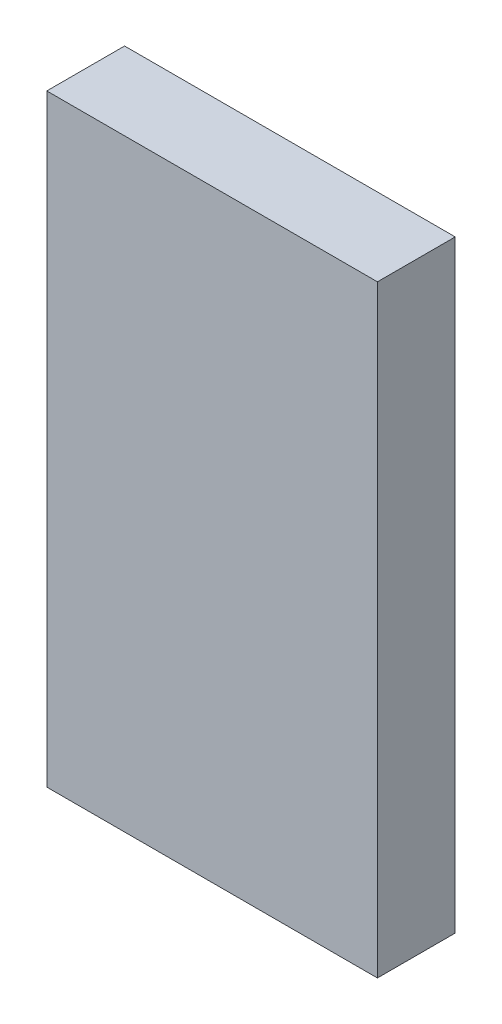
ISO-10303-21;
HEADER;
FILE_DESCRIPTION(('STEP AP214'),'2;1');
FILE_NAME('part.step','',(''),(''),'','','');
FILE_SCHEMA(('AUTOMOTIVE_DESIGN { 1 0 10303 214 1 1 1 1 }'));
ENDSEC;
DATA;
#1=APPLICATION_CONTEXT('core data for automotive mechanical design processes');
#2=APPLICATION_PROTOCOL_DEFINITION('international standard','automotive_design',2000,#1);
#3=PRODUCT_CONTEXT('',#1,'mechanical');
#4=PRODUCT('Part','Part','',(#3));
#5=PRODUCT_RELATED_PRODUCT_CATEGORY('part','',(#4));
#6=PRODUCT_DEFINITION_FORMATION('','',#4);
#7=PRODUCT_DEFINITION_CONTEXT('part definition',#1,'design');
#8=PRODUCT_DEFINITION('design','',#6,#7);
#9=PRODUCT_DEFINITION_SHAPE('','',#8);
#10=(LENGTH_UNIT() NAMED_UNIT(*) SI_UNIT(.MILLI.,.METRE.));
#11=(NAMED_UNIT(*) PLANE_ANGLE_UNIT() SI_UNIT($,.RADIAN.));
#12=(NAMED_UNIT(*) SI_UNIT($,.STERADIAN.) SOLID_ANGLE_UNIT());
#13=UNCERTAINTY_MEASURE_WITH_UNIT(LENGTH_MEASURE(1.E-05),#10,'distance_accuracy_value','');
#14=(GEOMETRIC_REPRESENTATION_CONTEXT(3) GLOBAL_UNCERTAINTY_ASSIGNED_CONTEXT((#13)) GLOBAL_UNIT_ASSIGNED_CONTEXT((#10,
#11,#12)) REPRESENTATION_CONTEXT('',''));
#15=CARTESIAN_POINT('',(0.,0.,0.));
#16=DIRECTION('',(0.,0.,1.));
#17=DIRECTION('',(1.,0.,0.));
#18=AXIS2_PLACEMENT_3D('',#15,#16,#17);
#19=CARTESIAN_POINT('',(0.,31.,0.));
#20=DIRECTION('',(1.,0.,0.));
#21=DIRECTION('',(0.,0.,-1.));
#22=AXIS2_PLACEMENT_3D('',#19,#20,#21);
#23=PLANE('',#22);
#24=DIRECTION('',(0.,0.,1.));
#25=VECTOR('',#24,1.);
#26=CARTESIAN_POINT('',(0.,0.,0.));
#27=LINE('',#26,#25);
#28=CARTESIAN_POINT('',(0.,0.,-4.));
#29=VERTEX_POINT('',#28);
#30=CARTESIAN_POINT('',(0.,0.,0.));
#31=VERTEX_POINT('',#30);
#32=EDGE_CURVE('E106',#29,#31,#27,.T.);
#33=ORIENTED_EDGE('',*,*,#32,.T.);
#34=DIRECTION('',(0.,-1.,0.));
#35=VECTOR('',#34,1.);
#36=CARTESIAN_POINT('',(0.,31.,0.));
#37=LINE('',#36,#35);
#38=CARTESIAN_POINT('',(0.,31.,0.));
#39=VERTEX_POINT('',#38);
#40=EDGE_CURVE('E11',#39,#31,#37,.T.);
#41=ORIENTED_EDGE('',*,*,#40,.F.);
#42=DIRECTION('',(0.,0.,1.));
#43=VECTOR('',#42,1.);
#44=CARTESIAN_POINT('',(0.,31.,0.));
#45=LINE('',#44,#43);
#46=CARTESIAN_POINT('',(0.,31.,-4.));
#47=VERTEX_POINT('',#46);
#48=EDGE_CURVE('E94',#47,#39,#45,.T.);
#49=ORIENTED_EDGE('',*,*,#48,.F.);
#50=DIRECTION('',(0.,-1.,0.));
#51=VECTOR('',#50,1.);
#52=CARTESIAN_POINT('',(0.,31.,-4.));
#53=LINE('',#52,#51);
#54=EDGE_CURVE('E102',#47,#29,#53,.T.);
#55=ORIENTED_EDGE('',*,*,#54,.T.);
#56=EDGE_LOOP('',(#33,#41,#49,#55));
#57=FACE_BOUND('',#56,.T.);
#58=ADVANCED_FACE('F43',(#57),#23,.F.);
#59=CARTESIAN_POINT('',(0.,31.,0.));
#60=DIRECTION('',(0.,0.,-1.));
#61=DIRECTION('',(-1.,0.,0.));
#62=AXIS2_PLACEMENT_3D('',#59,#60,#61);
#63=PLANE('',#62);
#64=DIRECTION('',(1.,0.,0.));
#65=VECTOR('',#64,1.);
#66=CARTESIAN_POINT('',(0.,0.,0.));
#67=LINE('',#66,#65);
#68=CARTESIAN_POINT('',(17.,0.,0.));
#69=VERTEX_POINT('',#68);
#70=EDGE_CURVE('E98',#31,#69,#67,.T.);
#71=ORIENTED_EDGE('',*,*,#70,.T.);
#72=DIRECTION('',(0.,-1.,0.));
#73=VECTOR('',#72,1.);
#74=CARTESIAN_POINT('',(17.,31.,0.));
#75=LINE('',#74,#73);
#76=CARTESIAN_POINT('',(17.,31.,0.));
#77=VERTEX_POINT('',#76);
#78=EDGE_CURVE('E51',#77,#69,#75,.T.);
#79=ORIENTED_EDGE('',*,*,#78,.F.);
#80=DIRECTION('',(1.,0.,0.));
#81=VECTOR('',#80,1.);
#82=CARTESIAN_POINT('',(0.,31.,0.));
#83=LINE('',#82,#81);
#84=EDGE_CURVE('E89',#39,#77,#83,.T.);
#85=ORIENTED_EDGE('',*,*,#84,.F.);
#86=ORIENTED_EDGE('',*,*,#40,.T.);
#87=EDGE_LOOP('',(#71,#79,#85,#86));
#88=FACE_BOUND('',#87,.T.);
#89=ADVANCED_FACE('F97',(#88),#63,.F.);
#90=CARTESIAN_POINT('',(17.,31.,0.));
#91=DIRECTION('',(-1.,0.,0.));
#92=DIRECTION('',(0.,0.,1.));
#93=AXIS2_PLACEMENT_3D('',#90,#91,#92);
#94=PLANE('',#93);
#95=DIRECTION('',(0.,0.,-1.));
#96=VECTOR('',#95,1.);
#97=CARTESIAN_POINT('',(17.,0.,0.));
#98=LINE('',#97,#96);
#99=CARTESIAN_POINT('',(17.,0.,-4.));
#100=VERTEX_POINT('',#99);
#101=EDGE_CURVE('E76',#69,#100,#98,.T.);
#102=ORIENTED_EDGE('',*,*,#101,.T.);
#103=DIRECTION('',(0.,-1.,0.));
#104=VECTOR('',#103,1.);
#105=CARTESIAN_POINT('',(17.,31.,-4.));
#106=LINE('',#105,#104);
#107=CARTESIAN_POINT('',(17.,31.,-4.));
#108=VERTEX_POINT('',#107);
#109=EDGE_CURVE('E99',#108,#100,#106,.T.);
#110=ORIENTED_EDGE('',*,*,#109,.F.);
#111=DIRECTION('',(0.,0.,-1.));
#112=VECTOR('',#111,1.);
#113=CARTESIAN_POINT('',(17.,31.,0.));
#114=LINE('',#113,#112);
#115=EDGE_CURVE('E92',#77,#108,#114,.T.);
#116=ORIENTED_EDGE('',*,*,#115,.F.);
#117=ORIENTED_EDGE('',*,*,#78,.T.);
#118=EDGE_LOOP('',(#102,#110,#116,#117));
#119=FACE_BOUND('',#118,.T.);
#120=ADVANCED_FACE('F100',(#119),#94,.F.);
#121=CARTESIAN_POINT('',(0.,31.,-4.));
#122=DIRECTION('',(0.,0.,1.));
#123=DIRECTION('',(1.,0.,0.));
#124=AXIS2_PLACEMENT_3D('',#121,#122,#123);
#125=PLANE('',#124);
#126=DIRECTION('',(-1.,0.,0.));
#127=VECTOR('',#126,1.);
#128=CARTESIAN_POINT('',(0.,0.,-4.));
#129=LINE('',#128,#127);
#130=EDGE_CURVE('E82',#100,#29,#129,.T.);
#131=ORIENTED_EDGE('',*,*,#130,.T.);
#132=ORIENTED_EDGE('',*,*,#54,.F.);
#133=DIRECTION('',(-1.,0.,0.));
#134=VECTOR('',#133,1.);
#135=CARTESIAN_POINT('',(0.,31.,-4.));
#136=LINE('',#135,#134);
#137=EDGE_CURVE('E59',#108,#47,#136,.T.);
#138=ORIENTED_EDGE('',*,*,#137,.F.);
#139=ORIENTED_EDGE('',*,*,#109,.T.);
#140=EDGE_LOOP('',(#131,#132,#138,#139));
#141=FACE_BOUND('',#140,.T.);
#142=ADVANCED_FACE('F113',(#141),#125,.F.);
#143=CARTESIAN_POINT('',(0.,31.,0.));
#144=DIRECTION('',(0.,-1.,0.));
#145=DIRECTION('',(0.,0.,-1.));
#146=AXIS2_PLACEMENT_3D('',#143,#144,#145);
#147=PLANE('',#146);
#148=ORIENTED_EDGE('',*,*,#48,.T.);
#149=ORIENTED_EDGE('',*,*,#84,.T.);
#150=ORIENTED_EDGE('',*,*,#115,.T.);
#151=ORIENTED_EDGE('',*,*,#137,.T.);
#152=EDGE_LOOP('',(#148,#149,#150,#151));
#153=FACE_BOUND('',#152,.T.);
#154=ADVANCED_FACE('F90',(#153),#147,.F.);
#155=CARTESIAN_POINT('',(0.,0.,0.));
#156=DIRECTION('',(0.,-1.,0.));
#157=DIRECTION('',(0.,0.,-1.));
#158=AXIS2_PLACEMENT_3D('',#155,#156,#157);
#159=PLANE('',#158);
#160=ORIENTED_EDGE('',*,*,#32,.F.);
#161=ORIENTED_EDGE('',*,*,#130,.F.);
#162=ORIENTED_EDGE('',*,*,#101,.F.);
#163=ORIENTED_EDGE('',*,*,#70,.F.);
#164=EDGE_LOOP('',(#160,#161,#162,#163));
#165=FACE_BOUND('',#164,.T.);
#166=ADVANCED_FACE('F116',(#165),#159,.T.);
#167=CLOSED_SHELL('',(#58,#89,#120,#142,#154,#166));
#168=MANIFOLD_SOLID_BREP('B2',#167);
#169=ADVANCED_BREP_SHAPE_REPRESENTATION('',(#18,#168),#14);
#170=SHAPE_DEFINITION_REPRESENTATION(#9,#169);
ENDSEC;
END-ISO-10303-21;
